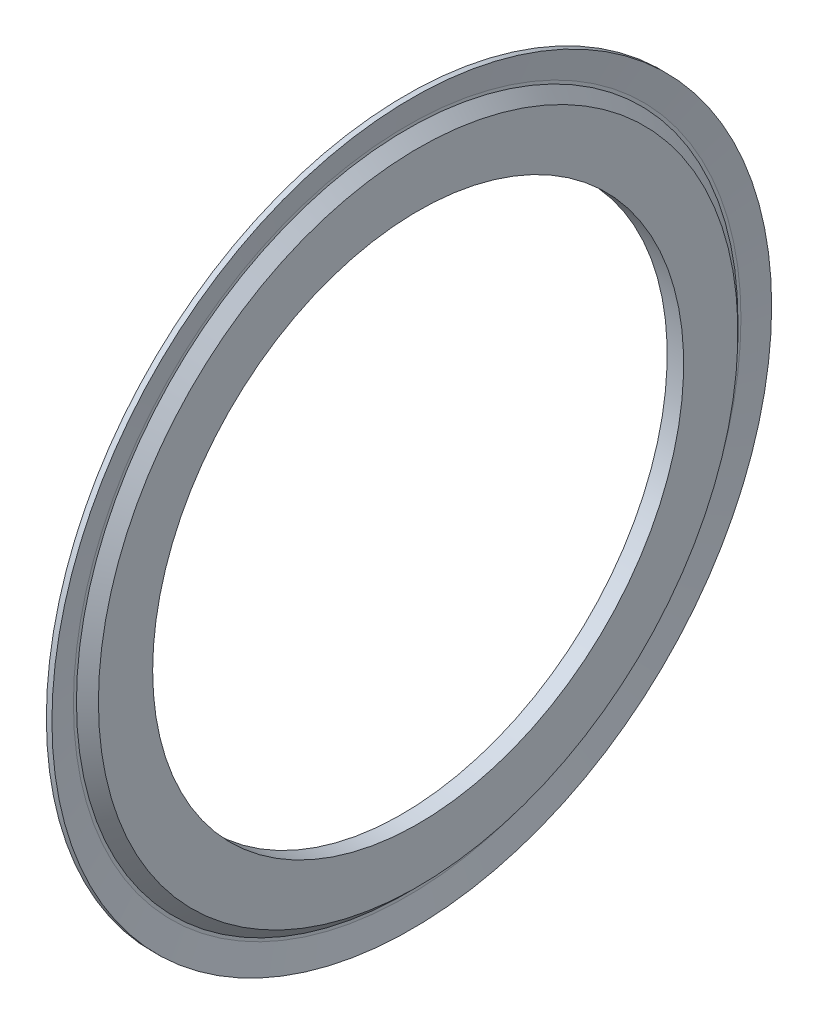
ISO-10303-21;
HEADER;
FILE_DESCRIPTION(('STEP AP214'),'2;1');
FILE_NAME('part.step','',(''),(''),'','','');
FILE_SCHEMA(('AUTOMOTIVE_DESIGN { 1 0 10303 214 1 1 1 1 }'));
ENDSEC;
DATA;
#1=APPLICATION_CONTEXT('core data for automotive mechanical design processes');
#2=APPLICATION_PROTOCOL_DEFINITION('international standard','automotive_design',2000,#1);
#3=PRODUCT_CONTEXT('',#1,'mechanical');
#4=PRODUCT('Part','Part','',(#3));
#5=PRODUCT_RELATED_PRODUCT_CATEGORY('part','',(#4));
#6=PRODUCT_DEFINITION_FORMATION('','',#4);
#7=PRODUCT_DEFINITION_CONTEXT('part definition',#1,'design');
#8=PRODUCT_DEFINITION('design','',#6,#7);
#9=PRODUCT_DEFINITION_SHAPE('','',#8);
#10=(LENGTH_UNIT() NAMED_UNIT(*) SI_UNIT(.MILLI.,.METRE.));
#11=(NAMED_UNIT(*) PLANE_ANGLE_UNIT() SI_UNIT($,.RADIAN.));
#12=(NAMED_UNIT(*) SI_UNIT($,.STERADIAN.) SOLID_ANGLE_UNIT());
#13=UNCERTAINTY_MEASURE_WITH_UNIT(LENGTH_MEASURE(1.E-05),#10,'distance_accuracy_value','');
#14=(GEOMETRIC_REPRESENTATION_CONTEXT(3) GLOBAL_UNCERTAINTY_ASSIGNED_CONTEXT((#13)) GLOBAL_UNIT_ASSIGNED_CONTEXT((#10,
#11,#12)) REPRESENTATION_CONTEXT('',''));
#15=CARTESIAN_POINT('',(0.,0.,0.));
#16=DIRECTION('',(0.,0.,1.));
#17=DIRECTION('',(1.,0.,0.));
#18=AXIS2_PLACEMENT_3D('',#15,#16,#17);
#19=CARTESIAN_POINT('',(4.47772656093822,0.,0.));
#20=DIRECTION('',(1.,0.,0.));
#21=DIRECTION('',(0.,0.,-1.));
#22=AXIS2_PLACEMENT_3D('',#19,#20,#21);
#23=CONICAL_SURFACE('',#22,8.13,1.39626340159546);
#24=CARTESIAN_POINT('',(4.58757826991959,0.,0.));
#25=DIRECTION('',(-1.,0.,0.));
#26=DIRECTION('',(0.,0.,1.));
#27=AXIS2_PLACEMENT_3D('',#24,#25,#26);
#28=CIRCLE('',#27,8.753);
#29=CARTESIAN_POINT('',(4.58757826991959,0.,8.753));
#30=VERTEX_POINT('',#29);
#31=EDGE_CURVE('E71',#30,#30,#28,.T.);
#32=ORIENTED_EDGE('',*,*,#31,.T.);
#33=EDGE_LOOP('',(#32));
#34=FACE_BOUND('',#33,.T.);
#35=CARTESIAN_POINT('',(4.47772656093822,0.,0.));
#36=DIRECTION('',(-1.,0.,0.));
#37=DIRECTION('',(0.,0.,1.));
#38=AXIS2_PLACEMENT_3D('',#35,#36,#37);
#39=CIRCLE('',#38,8.13);
#40=CARTESIAN_POINT('',(4.47772656093822,0.,8.13));
#41=VERTEX_POINT('',#40);
#42=EDGE_CURVE('E10',#41,#41,#39,.T.);
#43=ORIENTED_EDGE('',*,*,#42,.F.);
#44=EDGE_LOOP('',(#43));
#45=FACE_BOUND('',#44,.T.);
#46=ADVANCED_FACE('F14',(#34,#45),#23,.T.);
#47=CARTESIAN_POINT('',(4.47772656093822,8.13,0.));
#48=DIRECTION('',(1.,0.,0.));
#49=DIRECTION('',(0.,0.,-1.));
#50=AXIS2_PLACEMENT_3D('',#47,#48,#49);
#51=PLANE('',#50);
#52=CARTESIAN_POINT('',(4.47772656093822,0.,0.));
#53=DIRECTION('',(-1.,0.,0.));
#54=DIRECTION('',(0.,0.,1.));
#55=AXIS2_PLACEMENT_3D('',#52,#53,#54);
#56=CIRCLE('',#55,7.9892);
#57=CARTESIAN_POINT('',(4.47772656093822,0.,7.9892));
#58=VERTEX_POINT('',#57);
#59=EDGE_CURVE('E21',#58,#58,#56,.T.);
#60=ORIENTED_EDGE('',*,*,#59,.F.);
#61=EDGE_LOOP('',(#60));
#62=FACE_BOUND('',#61,.T.);
#63=ORIENTED_EDGE('',*,*,#42,.T.);
#64=EDGE_LOOP('',(#63));
#65=FACE_BOUND('',#64,.T.);
#66=ADVANCED_FACE('F92',(#62,#65),#51,.F.);
#67=CARTESIAN_POINT('',(4.74472656093822,0.,0.));
#68=DIRECTION('',(-1.,0.,0.));
#69=DIRECTION('',(0.,0.,1.));
#70=AXIS2_PLACEMENT_3D('',#67,#68,#69);
#71=CONICAL_SURFACE('',#70,7.7222,0.78539816339745);
#72=ORIENTED_EDGE('',*,*,#59,.T.);
#73=EDGE_LOOP('',(#72));
#74=FACE_BOUND('',#73,.T.);
#75=CARTESIAN_POINT('',(4.74472656093822,0.,0.));
#76=DIRECTION('',(-1.,0.,0.));
#77=DIRECTION('',(0.,0.,1.));
#78=AXIS2_PLACEMENT_3D('',#75,#76,#77);
#79=CIRCLE('',#78,7.7222);
#80=CARTESIAN_POINT('',(4.74472656093822,0.,7.7222));
#81=VERTEX_POINT('',#80);
#82=EDGE_CURVE('E30',#81,#81,#79,.T.);
#83=ORIENTED_EDGE('',*,*,#82,.F.);
#84=EDGE_LOOP('',(#83));
#85=FACE_BOUND('',#84,.T.);
#86=ADVANCED_FACE('F96',(#74,#85),#71,.F.);
#87=CARTESIAN_POINT('',(4.74472656093822,6.5915,0.));
#88=DIRECTION('',(-1.,0.,0.));
#89=DIRECTION('',(0.,0.,1.));
#90=AXIS2_PLACEMENT_3D('',#87,#88,#89);
#91=PLANE('',#90);
#92=ORIENTED_EDGE('',*,*,#82,.T.);
#93=EDGE_LOOP('',(#92));
#94=FACE_BOUND('',#93,.T.);
#95=CARTESIAN_POINT('',(4.74472656093822,0.,0.));
#96=DIRECTION('',(-1.,0.,0.));
#97=DIRECTION('',(0.,0.,1.));
#98=AXIS2_PLACEMENT_3D('',#95,#96,#97);
#99=CIRCLE('',#98,6.5915);
#100=CARTESIAN_POINT('',(4.74472656093822,0.,6.5915));
#101=VERTEX_POINT('',#100);
#102=EDGE_CURVE('E37',#101,#101,#99,.T.);
#103=ORIENTED_EDGE('',*,*,#102,.F.);
#104=EDGE_LOOP('',(#103));
#105=FACE_BOUND('',#104,.T.);
#106=ADVANCED_FACE('F101',(#94,#105),#91,.T.);
#107=CARTESIAN_POINT('',(4.47772656093822,0.,0.));
#108=DIRECTION('',(-1.,0.,0.));
#109=DIRECTION('',(0.,0.,1.));
#110=AXIS2_PLACEMENT_3D('',#107,#108,#109);
#111=CYLINDRICAL_SURFACE('',#110,6.5915);
#112=ORIENTED_EDGE('',*,*,#102,.T.);
#113=EDGE_LOOP('',(#112));
#114=FACE_BOUND('',#113,.T.);
#115=CARTESIAN_POINT('',(4.47772656093822,0.,0.));
#116=DIRECTION('',(-1.,0.,0.));
#117=DIRECTION('',(0.,0.,1.));
#118=AXIS2_PLACEMENT_3D('',#115,#116,#117);
#119=CIRCLE('',#118,6.5915);
#120=CARTESIAN_POINT('',(4.47772656093822,0.,6.5915));
#121=VERTEX_POINT('',#120);
#122=EDGE_CURVE('E43',#121,#121,#119,.T.);
#123=ORIENTED_EDGE('',*,*,#122,.F.);
#124=EDGE_LOOP('',(#123));
#125=FACE_BOUND('',#124,.T.);
#126=ADVANCED_FACE('F106',(#114,#125),#111,.T.);
#127=CARTESIAN_POINT('',(4.47772656093822,6.458,0.));
#128=DIRECTION('',(-1.,0.,0.));
#129=DIRECTION('',(0.,0.,1.));
#130=AXIS2_PLACEMENT_3D('',#127,#128,#129);
#131=PLANE('',#130);
#132=ORIENTED_EDGE('',*,*,#122,.T.);
#133=EDGE_LOOP('',(#132));
#134=FACE_BOUND('',#133,.T.);
#135=CARTESIAN_POINT('',(4.47772656093822,0.,0.));
#136=DIRECTION('',(-1.,0.,0.));
#137=DIRECTION('',(0.,0.,1.));
#138=AXIS2_PLACEMENT_3D('',#135,#136,#137);
#139=CIRCLE('',#138,6.458);
#140=CARTESIAN_POINT('',(4.47772656093822,0.,6.458));
#141=VERTEX_POINT('',#140);
#142=EDGE_CURVE('E47',#141,#141,#139,.T.);
#143=ORIENTED_EDGE('',*,*,#142,.F.);
#144=EDGE_LOOP('',(#143));
#145=FACE_BOUND('',#144,.T.);
#146=ADVANCED_FACE('F110',(#134,#145),#131,.T.);
#147=CARTESIAN_POINT('',(4.47772656093822,0.,0.));
#148=DIRECTION('',(-1.,0.,0.));
#149=DIRECTION('',(0.,0.,1.));
#150=AXIS2_PLACEMENT_3D('',#147,#148,#149);
#151=CYLINDRICAL_SURFACE('',#150,6.458);
#152=CARTESIAN_POINT('',(4.87822656093822,0.,0.));
#153=DIRECTION('',(-1.,0.,0.));
#154=DIRECTION('',(0.,0.,1.));
#155=AXIS2_PLACEMENT_3D('',#152,#153,#154);
#156=CIRCLE('',#155,6.458);
#157=CARTESIAN_POINT('',(4.87822656093822,0.,6.458));
#158=VERTEX_POINT('',#157);
#159=EDGE_CURVE('E51',#158,#158,#156,.T.);
#160=ORIENTED_EDGE('',*,*,#159,.F.);
#161=EDGE_LOOP('',(#160));
#162=FACE_BOUND('',#161,.T.);
#163=ORIENTED_EDGE('',*,*,#142,.T.);
#164=EDGE_LOOP('',(#163));
#165=FACE_BOUND('',#164,.T.);
#166=ADVANCED_FACE('F114',(#162,#165),#151,.F.);
#167=CARTESIAN_POINT('',(4.87822656093822,6.458,0.));
#168=DIRECTION('',(-1.,0.,0.));
#169=DIRECTION('',(0.,0.,1.));
#170=AXIS2_PLACEMENT_3D('',#167,#168,#169);
#171=PLANE('',#170);
#172=CARTESIAN_POINT('',(4.87822656093822,0.,0.));
#173=DIRECTION('',(-1.,0.,0.));
#174=DIRECTION('',(0.,0.,1.));
#175=AXIS2_PLACEMENT_3D('',#172,#173,#174);
#176=CIRCLE('',#175,7.77749751057681);
#177=CARTESIAN_POINT('',(4.87822656093822,0.,7.77749751057681));
#178=VERTEX_POINT('',#177);
#179=EDGE_CURVE('E55',#178,#178,#176,.T.);
#180=ORIENTED_EDGE('',*,*,#179,.F.);
#181=EDGE_LOOP('',(#180));
#182=FACE_BOUND('',#181,.T.);
#183=ORIENTED_EDGE('',*,*,#159,.T.);
#184=EDGE_LOOP('',(#183));
#185=FACE_BOUND('',#184,.T.);
#186=ADVANCED_FACE('F118',(#182,#185),#171,.F.);
#187=CARTESIAN_POINT('',(4.87822656093822,0.,0.));
#188=DIRECTION('',(-1.,0.,0.));
#189=DIRECTION('',(0.,0.,1.));
#190=AXIS2_PLACEMENT_3D('',#187,#188,#189);
#191=CONICAL_SURFACE('',#190,7.77749751057681,0.785398163397445);
#192=CARTESIAN_POINT('',(4.61122656093822,0.,0.));
#193=DIRECTION('',(-1.,0.,0.));
#194=DIRECTION('',(0.,0.,1.));
#195=AXIS2_PLACEMENT_3D('',#192,#193,#194);
#196=CIRCLE('',#195,8.04449751057681);
#197=CARTESIAN_POINT('',(4.61122656093822,0.,8.04449751057681));
#198=VERTEX_POINT('',#197);
#199=EDGE_CURVE('E59',#198,#198,#196,.T.);
#200=ORIENTED_EDGE('',*,*,#199,.F.);
#201=EDGE_LOOP('',(#200));
#202=FACE_BOUND('',#201,.T.);
#203=ORIENTED_EDGE('',*,*,#179,.T.);
#204=EDGE_LOOP('',(#203));
#205=FACE_BOUND('',#204,.T.);
#206=ADVANCED_FACE('F122',(#202,#205),#191,.T.);
#207=CARTESIAN_POINT('',(4.61122656093822,8.04449751057681,0.));
#208=DIRECTION('',(-1.,0.,0.));
#209=DIRECTION('',(0.,0.,1.));
#210=AXIS2_PLACEMENT_3D('',#207,#208,#209);
#211=PLANE('',#210);
#212=CARTESIAN_POINT('',(4.61122656093822,0.,0.));
#213=DIRECTION('',(-1.,0.,0.));
#214=DIRECTION('',(0.,0.,1.));
#215=AXIS2_PLACEMENT_3D('',#212,#213,#214);
#216=CIRCLE('',#215,8.11832026341929);
#217=CARTESIAN_POINT('',(4.61122656093822,0.,8.11832026341929));
#218=VERTEX_POINT('',#217);
#219=EDGE_CURVE('E63',#218,#218,#216,.T.);
#220=ORIENTED_EDGE('',*,*,#219,.F.);
#221=EDGE_LOOP('',(#220));
#222=FACE_BOUND('',#221,.T.);
#223=ORIENTED_EDGE('',*,*,#199,.T.);
#224=EDGE_LOOP('',(#223));
#225=FACE_BOUND('',#224,.T.);
#226=ADVANCED_FACE('F88',(#222,#225),#211,.F.);
#227=CARTESIAN_POINT('',(4.61122656093822,0.,0.));
#228=DIRECTION('',(1.,0.,0.));
#229=DIRECTION('',(0.,0.,-1.));
#230=AXIS2_PLACEMENT_3D('',#227,#228,#229);
#231=CONICAL_SURFACE('',#230,8.11832026341929,1.39626340159546);
#232=CARTESIAN_POINT('',(4.72313772260634,0.,0.));
#233=DIRECTION('',(-1.,0.,0.));
#234=DIRECTION('',(0.,0.,1.));
#235=AXIS2_PLACEMENT_3D('',#232,#233,#234);
#236=CIRCLE('',#235,8.753);
#237=CARTESIAN_POINT('',(4.72313772260634,0.,8.753));
#238=VERTEX_POINT('',#237);
#239=EDGE_CURVE('E67',#238,#238,#236,.T.);
#240=ORIENTED_EDGE('',*,*,#239,.F.);
#241=EDGE_LOOP('',(#240));
#242=FACE_BOUND('',#241,.T.);
#243=ORIENTED_EDGE('',*,*,#219,.T.);
#244=EDGE_LOOP('',(#243));
#245=FACE_BOUND('',#244,.T.);
#246=ADVANCED_FACE('F81',(#242,#245),#231,.F.);
#247=CARTESIAN_POINT('',(4.47772656093822,0.,0.));
#248=DIRECTION('',(-1.,0.,0.));
#249=DIRECTION('',(0.,0.,1.));
#250=AXIS2_PLACEMENT_3D('',#247,#248,#249);
#251=CYLINDRICAL_SURFACE('',#250,8.753);
#252=ORIENTED_EDGE('',*,*,#239,.T.);
#253=EDGE_LOOP('',(#252));
#254=FACE_BOUND('',#253,.T.);
#255=ORIENTED_EDGE('',*,*,#31,.F.);
#256=EDGE_LOOP('',(#255));
#257=FACE_BOUND('',#256,.T.);
#258=ADVANCED_FACE('F79',(#254,#257),#251,.T.);
#259=CLOSED_SHELL('',(#46,#66,#86,#106,#126,#146,#166,#186,#206,#226,#246,#258));
#260=MANIFOLD_SOLID_BREP('B1',#259);
#261=ADVANCED_BREP_SHAPE_REPRESENTATION('',(#18,#260),#14);
#262=SHAPE_DEFINITION_REPRESENTATION(#9,#261);
ENDSEC;
END-ISO-10303-21;
